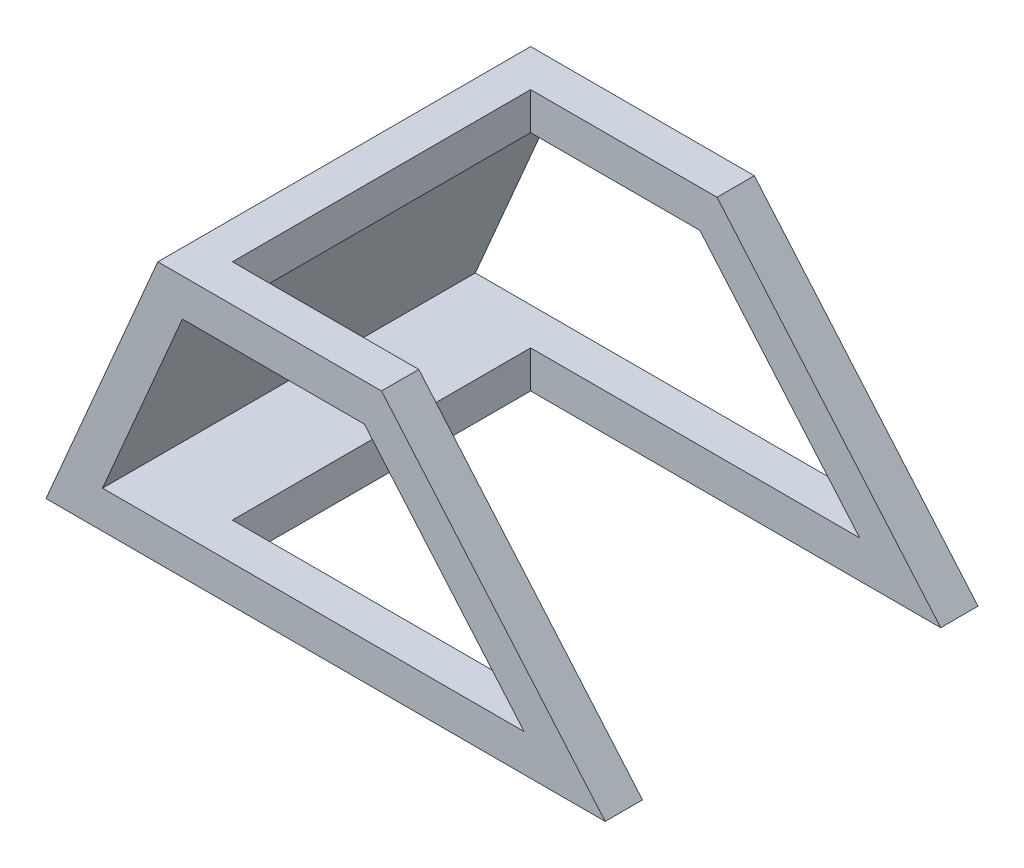
ISO-10303-21;
HEADER;
FILE_DESCRIPTION(('STEP AP214'),'2;1');
FILE_NAME('part.step','',(''),(''),'','','');
FILE_SCHEMA(('AUTOMOTIVE_DESIGN { 1 0 10303 214 1 1 1 1 }'));
ENDSEC;
DATA;
#1=APPLICATION_CONTEXT('core data for automotive mechanical design processes');
#2=APPLICATION_PROTOCOL_DEFINITION('international standard','automotive_design',2000,#1);
#3=PRODUCT_CONTEXT('',#1,'mechanical');
#4=PRODUCT('Part','Part','',(#3));
#5=PRODUCT_RELATED_PRODUCT_CATEGORY('part','',(#4));
#6=PRODUCT_DEFINITION_FORMATION('','',#4);
#7=PRODUCT_DEFINITION_CONTEXT('part definition',#1,'design');
#8=PRODUCT_DEFINITION('design','',#6,#7);
#9=PRODUCT_DEFINITION_SHAPE('','',#8);
#10=(LENGTH_UNIT() NAMED_UNIT(*) SI_UNIT(.MILLI.,.METRE.));
#11=(NAMED_UNIT(*) PLANE_ANGLE_UNIT() SI_UNIT($,.RADIAN.));
#12=(NAMED_UNIT(*) SI_UNIT($,.STERADIAN.) SOLID_ANGLE_UNIT());
#13=UNCERTAINTY_MEASURE_WITH_UNIT(LENGTH_MEASURE(1.E-05),#10,'distance_accuracy_value','');
#14=(GEOMETRIC_REPRESENTATION_CONTEXT(3) GLOBAL_UNCERTAINTY_ASSIGNED_CONTEXT((#13)) GLOBAL_UNIT_ASSIGNED_CONTEXT((#10,
#11,#12)) REPRESENTATION_CONTEXT('',''));
#15=CARTESIAN_POINT('',(0.,0.,0.));
#16=DIRECTION('',(0.,0.,1.));
#17=DIRECTION('',(1.,0.,0.));
#18=AXIS2_PLACEMENT_3D('',#15,#16,#17);
#19=CARTESIAN_POINT('',(0.,0.,100.));
#20=DIRECTION('',(0.,1.,0.));
#21=DIRECTION('',(0.,0.,1.));
#22=AXIS2_PLACEMENT_3D('',#19,#20,#21);
#23=PLANE('',#22);
#24=DIRECTION('',(-1.,0.,0.));
#25=VECTOR('',#24,1.);
#26=CARTESIAN_POINT('',(0.,0.,90.));
#27=LINE('',#26,#25);
#28=CARTESIAN_POINT('',(150.,0.,90.));
#29=VERTEX_POINT('',#28);
#30=CARTESIAN_POINT('',(40.,0.,90.));
#31=VERTEX_POINT('',#30);
#32=EDGE_CURVE('E173',#29,#31,#27,.T.);
#33=ORIENTED_EDGE('',*,*,#32,.F.);
#34=DIRECTION('',(0.,0.,-1.));
#35=VECTOR('',#34,1.);
#36=CARTESIAN_POINT('',(150.,0.,100.));
#37=LINE('',#36,#35);
#38=CARTESIAN_POINT('',(150.,0.,100.));
#39=VERTEX_POINT('',#38);
#40=EDGE_CURVE('E208',#39,#29,#37,.T.);
#41=ORIENTED_EDGE('',*,*,#40,.F.);
#42=DIRECTION('',(1.,0.,0.));
#43=VECTOR('',#42,1.);
#44=CARTESIAN_POINT('',(0.,0.,100.));
#45=LINE('',#44,#43);
#46=CARTESIAN_POINT('',(0.,0.,100.));
#47=VERTEX_POINT('',#46);
#48=EDGE_CURVE('E217',#47,#39,#45,.T.);
#49=ORIENTED_EDGE('',*,*,#48,.F.);
#50=DIRECTION('',(0.,0.,-1.));
#51=VECTOR('',#50,1.);
#52=CARTESIAN_POINT('',(0.,0.,100.));
#53=LINE('',#52,#51);
#54=CARTESIAN_POINT('',(0.,0.,0.));
#55=VERTEX_POINT('',#54);
#56=EDGE_CURVE('E189',#47,#55,#53,.T.);
#57=ORIENTED_EDGE('',*,*,#56,.T.);
#58=DIRECTION('',(1.,0.,0.));
#59=VECTOR('',#58,1.);
#60=CARTESIAN_POINT('',(0.,0.,0.));
#61=LINE('',#60,#59);
#62=CARTESIAN_POINT('',(150.,0.,0.));
#63=VERTEX_POINT('',#62);
#64=EDGE_CURVE('E192',#55,#63,#61,.T.);
#65=ORIENTED_EDGE('',*,*,#64,.T.);
#66=CARTESIAN_POINT('',(150.,0.,10.));
#67=VERTEX_POINT('',#66);
#68=EDGE_CURVE('E205',#67,#63,#37,.T.);
#69=ORIENTED_EDGE('',*,*,#68,.F.);
#70=DIRECTION('',(1.,0.,0.));
#71=VECTOR('',#70,1.);
#72=CARTESIAN_POINT('',(0.,0.,10.));
#73=LINE('',#72,#71);
#74=CARTESIAN_POINT('',(40.,0.,10.));
#75=VERTEX_POINT('',#74);
#76=EDGE_CURVE('E229',#75,#67,#73,.T.);
#77=ORIENTED_EDGE('',*,*,#76,.F.);
#78=DIRECTION('',(0.,0.,-1.));
#79=VECTOR('',#78,1.);
#80=CARTESIAN_POINT('',(40.,0.,100.));
#81=LINE('',#80,#79);
#82=EDGE_CURVE('E172',#31,#75,#81,.T.);
#83=ORIENTED_EDGE('',*,*,#82,.F.);
#84=EDGE_LOOP('',(#33,#41,#49,#57,#65,#69,#77,#83));
#85=FACE_BOUND('',#84,.T.);
#86=ADVANCED_FACE('F43',(#85),#23,.F.);
#87=CARTESIAN_POINT('',(150.,0.,100.));
#88=DIRECTION('',(-0.759256602365296,-0.650791373455968,0.));
#89=DIRECTION('',(0.650791373455968,-0.759256602365297,0.));
#90=AXIS2_PLACEMENT_3D('',#87,#88,#89);
#91=PLANE('',#90);
#92=DIRECTION('',(0.650791373455969,-0.759256602365297,0.));
#93=VECTOR('',#92,1.);
#94=CARTESIAN_POINT('',(150.,0.,90.));
#95=LINE('',#94,#93);
#96=CARTESIAN_POINT('',(90.,70.,90.));
#97=VERTEX_POINT('',#96);
#98=EDGE_CURVE('E248',#97,#29,#95,.T.);
#99=ORIENTED_EDGE('',*,*,#98,.F.);
#100=DIRECTION('',(0.,0.,-1.));
#101=VECTOR('',#100,1.);
#102=CARTESIAN_POINT('',(90.,70.,100.));
#103=LINE('',#102,#101);
#104=CARTESIAN_POINT('',(90.,70.,100.));
#105=VERTEX_POINT('',#104);
#106=EDGE_CURVE('E200',#105,#97,#103,.T.);
#107=ORIENTED_EDGE('',*,*,#106,.F.);
#108=DIRECTION('',(-0.650791373455968,0.759256602365297,0.));
#109=VECTOR('',#108,1.);
#110=CARTESIAN_POINT('',(150.,0.,100.));
#111=LINE('',#110,#109);
#112=EDGE_CURVE('E215',#39,#105,#111,.T.);
#113=ORIENTED_EDGE('',*,*,#112,.F.);
#114=ORIENTED_EDGE('',*,*,#40,.T.);
#115=EDGE_LOOP('',(#99,#107,#113,#114));
#116=FACE_BOUND('',#115,.T.);
#117=ADVANCED_FACE('F308',(#116),#91,.F.);
#118=DIRECTION('',(-0.650791373455969,0.759256602365297,0.));
#119=VECTOR('',#118,1.);
#120=CARTESIAN_POINT('',(150.,0.,10.));
#121=LINE('',#120,#119);
#122=CARTESIAN_POINT('',(90.,70.,10.));
#123=VERTEX_POINT('',#122);
#124=EDGE_CURVE('E260',#67,#123,#121,.T.);
#125=ORIENTED_EDGE('',*,*,#124,.F.);
#126=ORIENTED_EDGE('',*,*,#68,.T.);
#127=DIRECTION('',(-0.650791373455968,0.759256602365297,0.));
#128=VECTOR('',#127,1.);
#129=CARTESIAN_POINT('',(150.,0.,0.));
#130=LINE('',#129,#128);
#131=CARTESIAN_POINT('',(90.,70.,0.));
#132=VERTEX_POINT('',#131);
#133=EDGE_CURVE('E202',#63,#132,#130,.T.);
#134=ORIENTED_EDGE('',*,*,#133,.T.);
#135=EDGE_CURVE('E201',#123,#132,#103,.T.);
#136=ORIENTED_EDGE('',*,*,#135,.F.);
#137=EDGE_LOOP('',(#125,#126,#134,#136));
#138=FACE_BOUND('',#137,.T.);
#139=ADVANCED_FACE('F319',(#138),#91,.F.);
#140=CARTESIAN_POINT('',(90.,70.,100.));
#141=DIRECTION('',(0.,-1.,0.));
#142=DIRECTION('',(0.,0.,-1.));
#143=AXIS2_PLACEMENT_3D('',#140,#141,#142);
#144=PLANE('',#143);
#145=DIRECTION('',(1.,0.,0.));
#146=VECTOR('',#145,1.);
#147=CARTESIAN_POINT('',(90.,70.,90.));
#148=LINE('',#147,#146);
#149=CARTESIAN_POINT('',(40.,70.,90.));
#150=VERTEX_POINT('',#149);
#151=EDGE_CURVE('E254',#150,#97,#148,.T.);
#152=ORIENTED_EDGE('',*,*,#151,.F.);
#153=DIRECTION('',(0.,0.,1.));
#154=VECTOR('',#153,1.);
#155=CARTESIAN_POINT('',(40.,70.,100.));
#156=LINE('',#155,#154);
#157=CARTESIAN_POINT('',(40.,70.,10.));
#158=VERTEX_POINT('',#157);
#159=EDGE_CURVE('E52',#158,#150,#156,.T.);
#160=ORIENTED_EDGE('',*,*,#159,.F.);
#161=DIRECTION('',(-1.,0.,0.));
#162=VECTOR('',#161,1.);
#163=CARTESIAN_POINT('',(90.,70.,10.));
#164=LINE('',#163,#162);
#165=EDGE_CURVE('E262',#123,#158,#164,.T.);
#166=ORIENTED_EDGE('',*,*,#165,.F.);
#167=ORIENTED_EDGE('',*,*,#135,.T.);
#168=DIRECTION('',(-1.,0.,0.));
#169=VECTOR('',#168,1.);
#170=CARTESIAN_POINT('',(90.,70.,0.));
#171=LINE('',#170,#169);
#172=CARTESIAN_POINT('',(30.,70.,0.));
#173=VERTEX_POINT('',#172);
#174=EDGE_CURVE('E198',#132,#173,#171,.T.);
#175=ORIENTED_EDGE('',*,*,#174,.T.);
#176=DIRECTION('',(0.,0.,-1.));
#177=VECTOR('',#176,1.);
#178=CARTESIAN_POINT('',(30.,70.,100.));
#179=LINE('',#178,#177);
#180=CARTESIAN_POINT('',(30.,70.,100.));
#181=VERTEX_POINT('',#180);
#182=EDGE_CURVE('E193',#181,#173,#179,.T.);
#183=ORIENTED_EDGE('',*,*,#182,.F.);
#184=DIRECTION('',(-1.,0.,0.));
#185=VECTOR('',#184,1.);
#186=CARTESIAN_POINT('',(90.,70.,100.));
#187=LINE('',#186,#185);
#188=EDGE_CURVE('E212',#105,#181,#187,.T.);
#189=ORIENTED_EDGE('',*,*,#188,.F.);
#190=ORIENTED_EDGE('',*,*,#106,.T.);
#191=EDGE_LOOP('',(#152,#160,#166,#167,#175,#183,#189,#190));
#192=FACE_BOUND('',#191,.T.);
#193=ADVANCED_FACE('F303',(#192),#144,.F.);
#194=CARTESIAN_POINT('',(85.4006507752959,60.,100.));
#195=DIRECTION('',(0.,-1.,0.));
#196=DIRECTION('',(0.,0.,-1.));
#197=AXIS2_PLACEMENT_3D('',#194,#195,#196);
#198=PLANE('',#197);
#199=DIRECTION('',(0.,0.,1.));
#200=VECTOR('',#199,1.);
#201=CARTESIAN_POINT('',(40.,60.,100.));
#202=LINE('',#201,#200);
#203=CARTESIAN_POINT('',(40.,60.,10.));
#204=VERTEX_POINT('',#203);
#205=CARTESIAN_POINT('',(40.,60.,90.));
#206=VERTEX_POINT('',#205);
#207=EDGE_CURVE('E250',#204,#206,#202,.T.);
#208=ORIENTED_EDGE('',*,*,#207,.T.);
#209=DIRECTION('',(1.,0.,0.));
#210=VECTOR('',#209,1.);
#211=CARTESIAN_POINT('',(85.4006507752959,60.,90.));
#212=LINE('',#211,#210);
#213=CARTESIAN_POINT('',(85.4006507752958,60.,90.));
#214=VERTEX_POINT('',#213);
#215=EDGE_CURVE('E246',#206,#214,#212,.T.);
#216=ORIENTED_EDGE('',*,*,#215,.T.);
#217=DIRECTION('',(0.,0.,-1.));
#218=VECTOR('',#217,1.);
#219=CARTESIAN_POINT('',(85.4006507752959,60.,100.));
#220=LINE('',#219,#218);
#221=CARTESIAN_POINT('',(85.4006507752959,60.,100.));
#222=VERTEX_POINT('',#221);
#223=EDGE_CURVE('E46',#222,#214,#220,.T.);
#224=ORIENTED_EDGE('',*,*,#223,.F.);
#225=DIRECTION('',(-1.,0.,0.));
#226=VECTOR('',#225,1.);
#227=CARTESIAN_POINT('',(85.4006507752959,60.,100.));
#228=LINE('',#227,#226);
#229=CARTESIAN_POINT('',(36.5939615798056,60.,100.));
#230=VERTEX_POINT('',#229);
#231=EDGE_CURVE('E226',#222,#230,#228,.T.);
#232=ORIENTED_EDGE('',*,*,#231,.T.);
#233=DIRECTION('',(0.,0.,-1.));
#234=VECTOR('',#233,1.);
#235=CARTESIAN_POINT('',(36.5939615798056,60.,100.));
#236=LINE('',#235,#234);
#237=CARTESIAN_POINT('',(36.5939615798056,60.,0.));
#238=VERTEX_POINT('',#237);
#239=EDGE_CURVE('E222',#230,#238,#236,.T.);
#240=ORIENTED_EDGE('',*,*,#239,.T.);
#241=DIRECTION('',(-1.,0.,0.));
#242=VECTOR('',#241,1.);
#243=CARTESIAN_POINT('',(85.4006507752959,60.,0.));
#244=LINE('',#243,#242);
#245=CARTESIAN_POINT('',(85.4006507752958,60.,0.));
#246=VERTEX_POINT('',#245);
#247=EDGE_CURVE('E214',#246,#238,#244,.T.);
#248=ORIENTED_EDGE('',*,*,#247,.F.);
#249=CARTESIAN_POINT('',(85.4006507752959,60.,10.));
#250=VERTEX_POINT('',#249);
#251=EDGE_CURVE('E188',#250,#246,#220,.T.);
#252=ORIENTED_EDGE('',*,*,#251,.F.);
#253=DIRECTION('',(-1.,0.,0.));
#254=VECTOR('',#253,1.);
#255=CARTESIAN_POINT('',(85.4006507752959,60.,10.));
#256=LINE('',#255,#254);
#257=EDGE_CURVE('E225',#250,#204,#256,.T.);
#258=ORIENTED_EDGE('',*,*,#257,.T.);
#259=EDGE_LOOP('',(#208,#216,#224,#232,#240,#248,#252,#258));
#260=FACE_BOUND('',#259,.T.);
#261=ADVANCED_FACE('F283',(#260),#198,.T.);
#262=CARTESIAN_POINT('',(15.1653901512342,10.,100.));
#263=DIRECTION('',(0.,1.,0.));
#264=DIRECTION('',(0.,0.,1.));
#265=AXIS2_PLACEMENT_3D('',#262,#263,#264);
#266=PLANE('',#265);
#267=DIRECTION('',(0.,0.,-1.));
#268=VECTOR('',#267,1.);
#269=CARTESIAN_POINT('',(128.257793632439,10.,100.));
#270=LINE('',#269,#268);
#271=CARTESIAN_POINT('',(128.257793632439,10.,100.));
#272=VERTEX_POINT('',#271);
#273=CARTESIAN_POINT('',(128.257793632439,10.,90.));
#274=VERTEX_POINT('',#273);
#275=EDGE_CURVE('E180',#272,#274,#270,.T.);
#276=ORIENTED_EDGE('',*,*,#275,.T.);
#277=DIRECTION('',(-1.,0.,0.));
#278=VECTOR('',#277,1.);
#279=CARTESIAN_POINT('',(15.1653901512342,10.,90.));
#280=LINE('',#279,#278);
#281=CARTESIAN_POINT('',(40.,10.,90.));
#282=VERTEX_POINT('',#281);
#283=EDGE_CURVE('E178',#274,#282,#280,.T.);
#284=ORIENTED_EDGE('',*,*,#283,.T.);
#285=DIRECTION('',(0.,0.,-1.));
#286=VECTOR('',#285,1.);
#287=CARTESIAN_POINT('',(40.,10.,100.));
#288=LINE('',#287,#286);
#289=CARTESIAN_POINT('',(40.,10.,10.));
#290=VERTEX_POINT('',#289);
#291=EDGE_CURVE('E165',#282,#290,#288,.T.);
#292=ORIENTED_EDGE('',*,*,#291,.T.);
#293=DIRECTION('',(1.,0.,0.));
#294=VECTOR('',#293,1.);
#295=CARTESIAN_POINT('',(15.1653901512342,10.,10.));
#296=LINE('',#295,#294);
#297=CARTESIAN_POINT('',(128.257793632439,10.,10.));
#298=VERTEX_POINT('',#297);
#299=EDGE_CURVE('E153',#290,#298,#296,.T.);
#300=ORIENTED_EDGE('',*,*,#299,.T.);
#301=CARTESIAN_POINT('',(128.257793632439,10.,0.));
#302=VERTEX_POINT('',#301);
#303=EDGE_CURVE('E164',#298,#302,#270,.T.);
#304=ORIENTED_EDGE('',*,*,#303,.T.);
#305=DIRECTION('',(1.,0.,0.));
#306=VECTOR('',#305,1.);
#307=CARTESIAN_POINT('',(15.1653901512342,10.,0.));
#308=LINE('',#307,#306);
#309=CARTESIAN_POINT('',(15.1653901512342,10.,0.));
#310=VERTEX_POINT('',#309);
#311=EDGE_CURVE('E232',#310,#302,#308,.T.);
#312=ORIENTED_EDGE('',*,*,#311,.F.);
#313=DIRECTION('',(0.,0.,-1.));
#314=VECTOR('',#313,1.);
#315=CARTESIAN_POINT('',(15.1653901512342,10.,100.));
#316=LINE('',#315,#314);
#317=CARTESIAN_POINT('',(15.1653901512342,10.,100.));
#318=VERTEX_POINT('',#317);
#319=EDGE_CURVE('E227',#318,#310,#316,.T.);
#320=ORIENTED_EDGE('',*,*,#319,.F.);
#321=DIRECTION('',(1.,0.,0.));
#322=VECTOR('',#321,1.);
#323=CARTESIAN_POINT('',(15.1653901512342,10.,100.));
#324=LINE('',#323,#322);
#325=EDGE_CURVE('E241',#318,#272,#324,.T.);
#326=ORIENTED_EDGE('',*,*,#325,.T.);
#327=EDGE_LOOP('',(#276,#284,#292,#300,#304,#312,#320,#326));
#328=FACE_BOUND('',#327,.T.);
#329=ADVANCED_FACE('F177',(#328),#266,.T.);
#330=CARTESIAN_POINT('',(128.257793632439,10.,100.));
#331=DIRECTION('',(-0.759256602365296,-0.650791373455969,0.));
#332=DIRECTION('',(0.650791373455969,-0.759256602365297,0.));
#333=AXIS2_PLACEMENT_3D('',#330,#331,#332);
#334=PLANE('',#333);
#335=ORIENTED_EDGE('',*,*,#223,.T.);
#336=DIRECTION('',(0.650791373455969,-0.759256602365296,0.));
#337=VECTOR('',#336,1.);
#338=CARTESIAN_POINT('',(128.257793632439,10.,90.));
#339=LINE('',#338,#337);
#340=EDGE_CURVE('E183',#214,#274,#339,.T.);
#341=ORIENTED_EDGE('',*,*,#340,.T.);
#342=ORIENTED_EDGE('',*,*,#275,.F.);
#343=DIRECTION('',(-0.650791373455969,0.759256602365296,0.));
#344=VECTOR('',#343,1.);
#345=CARTESIAN_POINT('',(128.257793632439,10.,100.));
#346=LINE('',#345,#344);
#347=EDGE_CURVE('E186',#272,#222,#346,.T.);
#348=ORIENTED_EDGE('',*,*,#347,.T.);
#349=EDGE_LOOP('',(#335,#341,#342,#348));
#350=FACE_BOUND('',#349,.T.);
#351=ADVANCED_FACE('F292',(#350),#334,.T.);
#352=ORIENTED_EDGE('',*,*,#303,.F.);
#353=DIRECTION('',(-0.650791373455969,0.759256602365296,0.));
#354=VECTOR('',#353,1.);
#355=CARTESIAN_POINT('',(128.257793632439,10.,10.));
#356=LINE('',#355,#354);
#357=EDGE_CURVE('E160',#298,#250,#356,.T.);
#358=ORIENTED_EDGE('',*,*,#357,.T.);
#359=ORIENTED_EDGE('',*,*,#251,.T.);
#360=DIRECTION('',(-0.650791373455969,0.759256602365296,0.));
#361=VECTOR('',#360,1.);
#362=CARTESIAN_POINT('',(128.257793632439,10.,0.));
#363=LINE('',#362,#361);
#364=EDGE_CURVE('E211',#302,#246,#363,.T.);
#365=ORIENTED_EDGE('',*,*,#364,.F.);
#366=EDGE_LOOP('',(#352,#358,#359,#365));
#367=FACE_BOUND('',#366,.T.);
#368=ADVANCED_FACE('F273',(#367),#334,.T.);
#369=CARTESIAN_POINT('',(0.,0.,100.));
#370=DIRECTION('',(0.,0.,1.));
#371=DIRECTION('',(1.,0.,0.));
#372=AXIS2_PLACEMENT_3D('',#369,#370,#371);
#373=PLANE('',#372);
#374=DIRECTION('',(-0.393919298579168,-0.919145030018058,0.));
#375=VECTOR('',#374,1.);
#376=CARTESIAN_POINT('',(30.,70.,100.));
#377=LINE('',#376,#375);
#378=EDGE_CURVE('E219',#181,#47,#377,.T.);
#379=ORIENTED_EDGE('',*,*,#378,.T.);
#380=ORIENTED_EDGE('',*,*,#48,.T.);
#381=ORIENTED_EDGE('',*,*,#112,.T.);
#382=ORIENTED_EDGE('',*,*,#188,.T.);
#383=EDGE_LOOP('',(#379,#380,#381,#382));
#384=FACE_BOUND('',#383,.T.);
#385=DIRECTION('',(-0.393919298579168,-0.919145030018058,0.));
#386=VECTOR('',#385,1.);
#387=CARTESIAN_POINT('',(36.5939615798056,60.,100.));
#388=LINE('',#387,#386);
#389=EDGE_CURVE('E196',#230,#318,#388,.T.);
#390=ORIENTED_EDGE('',*,*,#389,.F.);
#391=ORIENTED_EDGE('',*,*,#231,.F.);
#392=ORIENTED_EDGE('',*,*,#347,.F.);
#393=ORIENTED_EDGE('',*,*,#325,.F.);
#394=EDGE_LOOP('',(#390,#391,#392,#393));
#395=FACE_BOUND('',#394,.T.);
#396=ADVANCED_FACE('F289',(#384,#395),#373,.T.);
#397=CARTESIAN_POINT('',(0.,0.,0.));
#398=DIRECTION('',(0.,0.,1.));
#399=DIRECTION('',(1.,0.,0.));
#400=AXIS2_PLACEMENT_3D('',#397,#398,#399);
#401=PLANE('',#400);
#402=DIRECTION('',(-0.393919298579168,-0.919145030018058,0.));
#403=VECTOR('',#402,1.);
#404=CARTESIAN_POINT('',(30.,70.,0.));
#405=LINE('',#404,#403);
#406=EDGE_CURVE('E197',#173,#55,#405,.T.);
#407=ORIENTED_EDGE('',*,*,#406,.F.);
#408=ORIENTED_EDGE('',*,*,#174,.F.);
#409=ORIENTED_EDGE('',*,*,#133,.F.);
#410=ORIENTED_EDGE('',*,*,#64,.F.);
#411=EDGE_LOOP('',(#407,#408,#409,#410));
#412=FACE_BOUND('',#411,.T.);
#413=ORIENTED_EDGE('',*,*,#247,.T.);
#414=DIRECTION('',(-0.393919298579168,-0.919145030018058,0.));
#415=VECTOR('',#414,1.);
#416=CARTESIAN_POINT('',(36.5939615798056,60.,0.));
#417=LINE('',#416,#415);
#418=EDGE_CURVE('E235',#238,#310,#417,.T.);
#419=ORIENTED_EDGE('',*,*,#418,.T.);
#420=ORIENTED_EDGE('',*,*,#311,.T.);
#421=ORIENTED_EDGE('',*,*,#364,.T.);
#422=EDGE_LOOP('',(#413,#419,#420,#421));
#423=FACE_BOUND('',#422,.T.);
#424=ADVANCED_FACE('F277',(#412,#423),#401,.F.);
#425=CARTESIAN_POINT('',(30.,70.,100.));
#426=DIRECTION('',(0.919145030018058,-0.393919298579168,0.));
#427=DIRECTION('',(0.393919298579168,0.919145030018058,0.));
#428=AXIS2_PLACEMENT_3D('',#425,#426,#427);
#429=PLANE('',#428);
#430=ORIENTED_EDGE('',*,*,#406,.T.);
#431=ORIENTED_EDGE('',*,*,#56,.F.);
#432=ORIENTED_EDGE('',*,*,#378,.F.);
#433=ORIENTED_EDGE('',*,*,#182,.T.);
#434=EDGE_LOOP('',(#430,#431,#432,#433));
#435=FACE_BOUND('',#434,.T.);
#436=ADVANCED_FACE('F325',(#435),#429,.F.);
#437=CARTESIAN_POINT('',(36.5939615798056,60.,100.));
#438=DIRECTION('',(0.919145030018058,-0.393919298579168,0.));
#439=DIRECTION('',(0.393919298579168,0.919145030018058,0.));
#440=AXIS2_PLACEMENT_3D('',#437,#438,#439);
#441=PLANE('',#440);
#442=ORIENTED_EDGE('',*,*,#418,.F.);
#443=ORIENTED_EDGE('',*,*,#239,.F.);
#444=ORIENTED_EDGE('',*,*,#389,.T.);
#445=ORIENTED_EDGE('',*,*,#319,.T.);
#446=EDGE_LOOP('',(#442,#443,#444,#445));
#447=FACE_BOUND('',#446,.T.);
#448=ADVANCED_FACE('F280',(#447),#441,.T.);
#449=CARTESIAN_POINT('',(150.,70.000012,10.));
#450=DIRECTION('',(0.,0.,1.));
#451=DIRECTION('',(1.,0.,0.));
#452=AXIS2_PLACEMENT_3D('',#449,#450,#451);
#453=PLANE('',#452);
#454=ORIENTED_EDGE('',*,*,#76,.T.);
#455=ORIENTED_EDGE('',*,*,#124,.T.);
#456=ORIENTED_EDGE('',*,*,#165,.T.);
#457=DIRECTION('',(0.,-1.,0.));
#458=VECTOR('',#457,1.);
#459=CARTESIAN_POINT('',(40.,70.000012,10.));
#460=LINE('',#459,#458);
#461=EDGE_CURVE('E62',#158,#204,#460,.T.);
#462=ORIENTED_EDGE('',*,*,#461,.T.);
#463=ORIENTED_EDGE('',*,*,#257,.F.);
#464=ORIENTED_EDGE('',*,*,#357,.F.);
#465=ORIENTED_EDGE('',*,*,#299,.F.);
#466=EDGE_CURVE('E157',#290,#75,#460,.T.);
#467=ORIENTED_EDGE('',*,*,#466,.T.);
#468=EDGE_LOOP('',(#454,#455,#456,#462,#463,#464,#465,#467));
#469=FACE_BOUND('',#468,.T.);
#470=ADVANCED_FACE('F156',(#469),#453,.T.);
#471=CARTESIAN_POINT('',(50.,70.000012,90.));
#472=DIRECTION('',(0.,0.,-1.));
#473=DIRECTION('',(-1.,0.,0.));
#474=AXIS2_PLACEMENT_3D('',#471,#472,#473);
#475=PLANE('',#474);
#476=ORIENTED_EDGE('',*,*,#32,.T.);
#477=DIRECTION('',(0.,-1.,0.));
#478=VECTOR('',#477,1.);
#479=CARTESIAN_POINT('',(40.,70.000012,90.));
#480=LINE('',#479,#478);
#481=EDGE_CURVE('E54',#282,#31,#480,.T.);
#482=ORIENTED_EDGE('',*,*,#481,.F.);
#483=ORIENTED_EDGE('',*,*,#283,.F.);
#484=ORIENTED_EDGE('',*,*,#340,.F.);
#485=ORIENTED_EDGE('',*,*,#215,.F.);
#486=EDGE_CURVE('E11',#150,#206,#480,.T.);
#487=ORIENTED_EDGE('',*,*,#486,.F.);
#488=ORIENTED_EDGE('',*,*,#151,.T.);
#489=ORIENTED_EDGE('',*,*,#98,.T.);
#490=EDGE_LOOP('',(#476,#482,#483,#484,#485,#487,#488,#489));
#491=FACE_BOUND('',#490,.T.);
#492=ADVANCED_FACE('F294',(#491),#475,.T.);
#493=CARTESIAN_POINT('',(40.,70.000012,20.));
#494=DIRECTION('',(1.,0.,0.));
#495=DIRECTION('',(0.,0.,-1.));
#496=AXIS2_PLACEMENT_3D('',#493,#494,#495);
#497=PLANE('',#496);
#498=ORIENTED_EDGE('',*,*,#82,.T.);
#499=ORIENTED_EDGE('',*,*,#466,.F.);
#500=ORIENTED_EDGE('',*,*,#291,.F.);
#501=ORIENTED_EDGE('',*,*,#481,.T.);
#502=EDGE_LOOP('',(#498,#499,#500,#501));
#503=FACE_BOUND('',#502,.T.);
#504=ADVANCED_FACE('F168',(#503),#497,.T.);
#505=ORIENTED_EDGE('',*,*,#159,.T.);
#506=ORIENTED_EDGE('',*,*,#486,.T.);
#507=ORIENTED_EDGE('',*,*,#207,.F.);
#508=ORIENTED_EDGE('',*,*,#461,.F.);
#509=EDGE_LOOP('',(#505,#506,#507,#508));
#510=FACE_BOUND('',#509,.T.);
#511=ADVANCED_FACE('F296',(#510),#497,.T.);
#512=CLOSED_SHELL('',(#86,#117,#139,#193,#261,#329,#351,#368,#396,#424,#436,#448,#470,#492,#504,#511));
#513=MANIFOLD_SOLID_BREP('B2',#512);
#514=ADVANCED_BREP_SHAPE_REPRESENTATION('',(#18,#513),#14);
#515=SHAPE_DEFINITION_REPRESENTATION(#9,#514);
ENDSEC;
END-ISO-10303-21;
